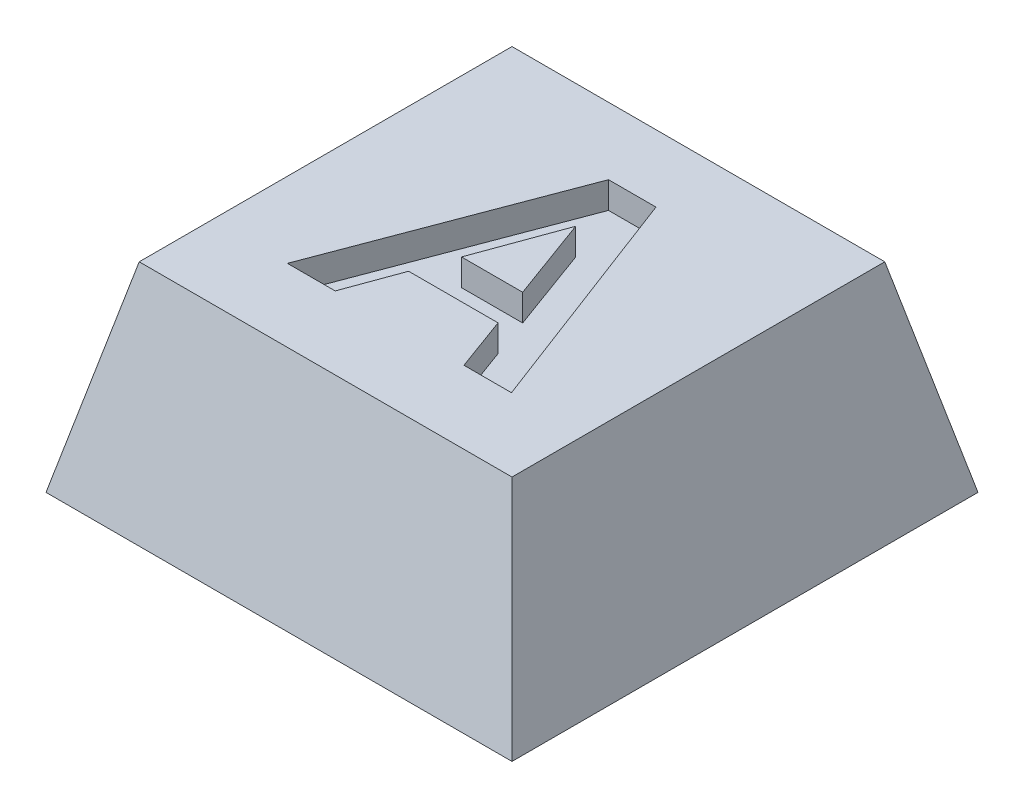
ISO-10303-21;
HEADER;
FILE_DESCRIPTION(('STEP AP214'),'2;1');
FILE_NAME('part.step','',(''),(''),'','','');
FILE_SCHEMA(('AUTOMOTIVE_DESIGN { 1 0 10303 214 1 1 1 1 }'));
ENDSEC;
DATA;
#1=APPLICATION_CONTEXT('core data for automotive mechanical design processes');
#2=APPLICATION_PROTOCOL_DEFINITION('international standard','automotive_design',2000,#1);
#3=PRODUCT_CONTEXT('',#1,'mechanical');
#4=PRODUCT('Part','Part','',(#3));
#5=PRODUCT_RELATED_PRODUCT_CATEGORY('part','',(#4));
#6=PRODUCT_DEFINITION_FORMATION('','',#4);
#7=PRODUCT_DEFINITION_CONTEXT('part definition',#1,'design');
#8=PRODUCT_DEFINITION('design','',#6,#7);
#9=PRODUCT_DEFINITION_SHAPE('','',#8);
#10=(LENGTH_UNIT() NAMED_UNIT(*) SI_UNIT(.MILLI.,.METRE.));
#11=(NAMED_UNIT(*) PLANE_ANGLE_UNIT() SI_UNIT($,.RADIAN.));
#12=(NAMED_UNIT(*) SI_UNIT($,.STERADIAN.) SOLID_ANGLE_UNIT());
#13=UNCERTAINTY_MEASURE_WITH_UNIT(LENGTH_MEASURE(1.E-05),#10,'distance_accuracy_value','');
#14=(GEOMETRIC_REPRESENTATION_CONTEXT(3) GLOBAL_UNCERTAINTY_ASSIGNED_CONTEXT((#13)) GLOBAL_UNIT_ASSIGNED_CONTEXT((#10,
#11,#12)) REPRESENTATION_CONTEXT('',''));
#15=CARTESIAN_POINT('',(0.,0.,0.));
#16=DIRECTION('',(0.,0.,1.));
#17=DIRECTION('',(1.,0.,0.));
#18=AXIS2_PLACEMENT_3D('',#15,#16,#17);
#19=CARTESIAN_POINT('',(0.,3.,0.));
#20=DIRECTION('',(0.,-1.,0.));
#21=DIRECTION('',(0.,0.,-1.));
#22=AXIS2_PLACEMENT_3D('',#19,#20,#21);
#23=PLANE('',#22);
#24=DIRECTION('',(-1.,0.,0.));
#25=VECTOR('',#24,1.);
#26=CARTESIAN_POINT('',(11.,3.,-0.7));
#27=LINE('',#26,#25);
#28=CARTESIAN_POINT('',(6.3,3.,-0.7));
#29=VERTEX_POINT('',#28);
#30=CARTESIAN_POINT('',(0.7,3.,-0.7));
#31=VERTEX_POINT('',#30);
#32=EDGE_CURVE('E280',#29,#31,#27,.T.);
#33=ORIENTED_EDGE('',*,*,#32,.F.);
#34=DIRECTION('',(0.,0.,1.));
#35=VECTOR('',#34,1.);
#36=CARTESIAN_POINT('',(6.3,3.,-7.));
#37=LINE('',#36,#35);
#38=CARTESIAN_POINT('',(6.3,3.,-6.3));
#39=VERTEX_POINT('',#38);
#40=EDGE_CURVE('E292',#39,#29,#37,.T.);
#41=ORIENTED_EDGE('',*,*,#40,.F.);
#42=DIRECTION('',(-1.,0.,0.));
#43=VECTOR('',#42,1.);
#44=CARTESIAN_POINT('',(11.,3.,-6.3));
#45=LINE('',#44,#43);
#46=CARTESIAN_POINT('',(0.699999999999998,3.,-6.3));
#47=VERTEX_POINT('',#46);
#48=EDGE_CURVE('E276',#39,#47,#45,.T.);
#49=ORIENTED_EDGE('',*,*,#48,.T.);
#50=DIRECTION('',(0.,0.,1.));
#51=VECTOR('',#50,1.);
#52=CARTESIAN_POINT('',(0.7,3.,-7.));
#53=LINE('',#52,#51);
#54=EDGE_CURVE('E293',#47,#31,#53,.T.);
#55=ORIENTED_EDGE('',*,*,#54,.T.);
#56=EDGE_LOOP('',(#33,#41,#49,#55));
#57=FACE_BOUND('',#56,.T.);
#58=DIRECTION('',(0.355060662326772,0.,0.934843262835046));
#59=VECTOR('',#58,1.);
#60=CARTESIAN_POINT('',(3.86955668779265,3.,-5.29301718970727));
#61=LINE('',#60,#59);
#62=CARTESIAN_POINT('',(3.86955668779265,3.,-5.29301718970727));
#63=VERTEX_POINT('',#62);
#64=CARTESIAN_POINT('',(5.19888361086957,3.,-1.79301718970727));
#65=VERTEX_POINT('',#64);
#66=EDGE_CURVE('E58',#63,#65,#61,.T.);
#67=ORIENTED_EDGE('',*,*,#66,.T.);
#68=DIRECTION('',(-1.,0.,0.));
#69=VECTOR('',#68,1.);
#70=CARTESIAN_POINT('',(5.19888361086957,3.,-1.79301718970727));
#71=LINE('',#70,#69);
#72=CARTESIAN_POINT('',(4.48514162369008,3.,-1.79301718970727));
#73=VERTEX_POINT('',#72);
#74=EDGE_CURVE('E221',#65,#73,#71,.T.);
#75=ORIENTED_EDGE('',*,*,#74,.T.);
#76=DIRECTION('',(-0.343248282132194,0.,-0.939244705501872));
#77=VECTOR('',#76,1.);
#78=CARTESIAN_POINT('',(4.48514162369008,3.,-1.79301718970727));
#79=LINE('',#78,#77);
#80=CARTESIAN_POINT('',(4.18996934804906,3.,-2.60070949739958));
#81=VERTEX_POINT('',#80);
#82=EDGE_CURVE('E225',#73,#81,#79,.T.);
#83=ORIENTED_EDGE('',*,*,#82,.T.);
#84=DIRECTION('',(-1.,0.,0.));
#85=VECTOR('',#84,1.);
#86=CARTESIAN_POINT('',(4.18996934804906,3.,-2.60070949739958));
#87=LINE('',#86,#85);
#88=CARTESIAN_POINT('',(2.8466199890747,3.,-2.60070949739958));
#89=VERTEX_POINT('',#88);
#90=EDGE_CURVE('E229',#81,#89,#87,.T.);
#91=ORIENTED_EDGE('',*,*,#90,.T.);
#92=DIRECTION('',(-0.343248282132194,0.,0.939244705501872));
#93=VECTOR('',#92,1.);
#94=CARTESIAN_POINT('',(2.8466199890747,3.,-2.60070949739958));
#95=LINE('',#94,#93);
#96=CARTESIAN_POINT('',(2.55144771343367,3.,-1.79301718970727));
#97=VERTEX_POINT('',#96);
#98=EDGE_CURVE('E233',#89,#97,#95,.T.);
#99=ORIENTED_EDGE('',*,*,#98,.T.);
#100=DIRECTION('',(-1.,0.,0.));
#101=VECTOR('',#100,1.);
#102=CARTESIAN_POINT('',(2.55144771343367,3.,-1.79301718970727));
#103=LINE('',#102,#101);
#104=CARTESIAN_POINT('',(1.83349899548495,3.,-1.79301718970727));
#105=VERTEX_POINT('',#104);
#106=EDGE_CURVE('E237',#97,#105,#103,.T.);
#107=ORIENTED_EDGE('',*,*,#106,.T.);
#108=DIRECTION('',(0.353586403368764,0.,-0.935401868371419));
#109=VECTOR('',#108,1.);
#110=CARTESIAN_POINT('',(1.83349899548495,3.,-1.79301718970727));
#111=LINE('',#110,#109);
#112=CARTESIAN_POINT('',(3.15651582240803,3.,-5.29301718970727));
#113=VERTEX_POINT('',#112);
#114=EDGE_CURVE('E241',#105,#113,#111,.T.);
#115=ORIENTED_EDGE('',*,*,#114,.T.);
#116=DIRECTION('',(1.,0.,0.));
#117=VECTOR('',#116,1.);
#118=CARTESIAN_POINT('',(3.15651582240803,3.,-5.29301718970727));
#119=LINE('',#118,#117);
#120=EDGE_CURVE('E197',#113,#63,#119,.T.);
#121=ORIENTED_EDGE('',*,*,#120,.T.);
#122=EDGE_LOOP('',(#67,#75,#83,#91,#99,#107,#115,#121));
#123=FACE_BOUND('',#122,.T.);
#124=ADVANCED_FACE('F42',(#57,#123),#23,.F.);
#125=CARTESIAN_POINT('',(7.,0.,-7.));
#126=DIRECTION('',(-0.973841209741793,-0.227229615606418,0.));
#127=DIRECTION('',(0.227229615606418,-0.973841209741793,0.));
#128=AXIS2_PLACEMENT_3D('',#125,#126,#127);
#129=PLANE('',#128);
#130=DIRECTION('',(-0.221581128241521,0.949633406749377,-0.221581128241521));
#131=VECTOR('',#130,1.);
#132=CARTESIAN_POINT('',(6.6563126252505,1.47294589178357,-0.343687374749499));
#133=LINE('',#132,#131);
#134=CARTESIAN_POINT('',(7.,0.,0.));
#135=VERTEX_POINT('',#134);
#136=EDGE_CURVE('E289',#135,#29,#133,.T.);
#137=ORIENTED_EDGE('',*,*,#136,.F.);
#138=DIRECTION('',(0.,0.,-1.));
#139=VECTOR('',#138,1.);
#140=CARTESIAN_POINT('',(7.,0.,0.));
#141=LINE('',#140,#139);
#142=CARTESIAN_POINT('',(7.,0.,-7.));
#143=VERTEX_POINT('',#142);
#144=EDGE_CURVE('E307',#135,#143,#141,.T.);
#145=ORIENTED_EDGE('',*,*,#144,.T.);
#146=DIRECTION('',(0.221581128241521,-0.949633406749377,-0.221581128241521));
#147=VECTOR('',#146,1.);
#148=CARTESIAN_POINT('',(7.,0.,-7.));
#149=LINE('',#148,#147);
#150=EDGE_CURVE('E283',#39,#143,#149,.T.);
#151=ORIENTED_EDGE('',*,*,#150,.F.);
#152=ORIENTED_EDGE('',*,*,#40,.T.);
#153=EDGE_LOOP('',(#137,#145,#151,#152));
#154=FACE_BOUND('',#153,.T.);
#155=ADVANCED_FACE('F333',(#154),#129,.F.);
#156=CARTESIAN_POINT('',(0.,0.,-7.));
#157=DIRECTION('',(0.973841209741793,-0.227229615606418,0.));
#158=DIRECTION('',(0.227229615606418,0.973841209741793,0.));
#159=AXIS2_PLACEMENT_3D('',#156,#157,#158);
#160=PLANE('',#159);
#161=DIRECTION('',(-0.221581128241521,-0.949633406749378,0.221581128241521));
#162=VECTOR('',#161,1.);
#163=CARTESIAN_POINT('',(0.343687374749499,1.47294589178357,-0.3436873747495));
#164=LINE('',#163,#162);
#165=CARTESIAN_POINT('',(0.,0.,0.));
#166=VERTEX_POINT('',#165);
#167=EDGE_CURVE('E11',#31,#166,#164,.T.);
#168=ORIENTED_EDGE('',*,*,#167,.F.);
#169=ORIENTED_EDGE('',*,*,#54,.F.);
#170=DIRECTION('',(0.221581128241521,0.949633406749377,0.221581128241521));
#171=VECTOR('',#170,1.);
#172=CARTESIAN_POINT('',(0.,0.,-7.));
#173=LINE('',#172,#171);
#174=CARTESIAN_POINT('',(0.,0.,-7.));
#175=VERTEX_POINT('',#174);
#176=EDGE_CURVE('E51',#175,#47,#173,.T.);
#177=ORIENTED_EDGE('',*,*,#176,.F.);
#178=DIRECTION('',(0.,0.,1.));
#179=VECTOR('',#178,1.);
#180=CARTESIAN_POINT('',(0.,0.,0.));
#181=LINE('',#180,#179);
#182=EDGE_CURVE('E297',#175,#166,#181,.T.);
#183=ORIENTED_EDGE('',*,*,#182,.T.);
#184=EDGE_LOOP('',(#168,#169,#177,#183));
#185=FACE_BOUND('',#184,.T.);
#186=ADVANCED_FACE('F327',(#185),#160,.F.);
#187=CARTESIAN_POINT('',(0.,0.,0.));
#188=DIRECTION('',(0.,-1.,0.));
#189=DIRECTION('',(0.,0.,-1.));
#190=AXIS2_PLACEMENT_3D('',#187,#188,#189);
#191=PLANE('',#190);
#192=CARTESIAN_POINT('',(3.5,0.,-3.5));
#193=DIRECTION('',(0.,-1.,0.));
#194=DIRECTION('',(0.,0.,-1.));
#195=AXIS2_PLACEMENT_3D('',#192,#193,#194);
#196=CIRCLE('',#195,1.8);
#197=CARTESIAN_POINT('',(3.5,0.,-5.3));
#198=VERTEX_POINT('',#197);
#199=EDGE_CURVE('E271',#198,#198,#196,.T.);
#200=ORIENTED_EDGE('',*,*,#199,.F.);
#201=EDGE_LOOP('',(#200));
#202=FACE_BOUND('',#201,.T.);
#203=ORIENTED_EDGE('',*,*,#182,.F.);
#204=DIRECTION('',(-1.,0.,0.));
#205=VECTOR('',#204,1.);
#206=CARTESIAN_POINT('',(0.,0.,-7.));
#207=LINE('',#206,#205);
#208=EDGE_CURVE('E311',#143,#175,#207,.T.);
#209=ORIENTED_EDGE('',*,*,#208,.F.);
#210=ORIENTED_EDGE('',*,*,#144,.F.);
#211=DIRECTION('',(1.,0.,0.));
#212=VECTOR('',#211,1.);
#213=CARTESIAN_POINT('',(0.,0.,0.));
#214=LINE('',#213,#212);
#215=EDGE_CURVE('E304',#166,#135,#214,.T.);
#216=ORIENTED_EDGE('',*,*,#215,.F.);
#217=EDGE_LOOP('',(#203,#209,#210,#216));
#218=FACE_BOUND('',#217,.T.);
#219=ADVANCED_FACE('F44',(#202,#218),#191,.T.);
#220=CARTESIAN_POINT('',(11.,3.,-6.3));
#221=DIRECTION('',(0.,0.227229615606418,-0.973841209741793));
#222=DIRECTION('',(0.,0.973841209741793,0.227229615606418));
#223=AXIS2_PLACEMENT_3D('',#220,#221,#222);
#224=PLANE('',#223);
#225=ORIENTED_EDGE('',*,*,#150,.T.);
#226=ORIENTED_EDGE('',*,*,#208,.T.);
#227=ORIENTED_EDGE('',*,*,#176,.T.);
#228=ORIENTED_EDGE('',*,*,#48,.F.);
#229=EDGE_LOOP('',(#225,#226,#227,#228));
#230=FACE_BOUND('',#229,.T.);
#231=ADVANCED_FACE('F316',(#230),#224,.T.);
#232=CARTESIAN_POINT('',(11.,0.,0.));
#233=DIRECTION('',(0.,0.227229615606418,0.973841209741793));
#234=DIRECTION('',(0.,-0.973841209741793,0.227229615606418));
#235=AXIS2_PLACEMENT_3D('',#232,#233,#234);
#236=PLANE('',#235);
#237=ORIENTED_EDGE('',*,*,#136,.T.);
#238=ORIENTED_EDGE('',*,*,#32,.T.);
#239=ORIENTED_EDGE('',*,*,#167,.T.);
#240=ORIENTED_EDGE('',*,*,#215,.T.);
#241=EDGE_LOOP('',(#237,#238,#239,#240));
#242=FACE_BOUND('',#241,.T.);
#243=ADVANCED_FACE('F330',(#242),#236,.T.);
#244=CARTESIAN_POINT('',(3.5,0.8,-3.5));
#245=DIRECTION('',(0.,-1.,0.));
#246=DIRECTION('',(0.,0.,-1.));
#247=AXIS2_PLACEMENT_3D('',#244,#245,#246);
#248=CYLINDRICAL_SURFACE('',#247,1.8);
#249=CARTESIAN_POINT('',(3.5,0.8,-3.5));
#250=DIRECTION('',(0.,-1.,0.));
#251=DIRECTION('',(0.,0.,-1.));
#252=AXIS2_PLACEMENT_3D('',#249,#250,#251);
#253=CIRCLE('',#252,1.8);
#254=CARTESIAN_POINT('',(3.5,0.8,-5.3));
#255=VERTEX_POINT('',#254);
#256=EDGE_CURVE('E272',#255,#255,#253,.T.);
#257=ORIENTED_EDGE('',*,*,#256,.F.);
#258=EDGE_LOOP('',(#257));
#259=FACE_BOUND('',#258,.T.);
#260=ORIENTED_EDGE('',*,*,#199,.T.);
#261=EDGE_LOOP('',(#260));
#262=FACE_BOUND('',#261,.T.);
#263=ADVANCED_FACE('F403',(#259,#262),#248,.F.);
#264=CARTESIAN_POINT('',(3.5,0.8,-3.5));
#265=DIRECTION('',(0.,-1.,0.));
#266=DIRECTION('',(0.,0.,-1.));
#267=AXIS2_PLACEMENT_3D('',#264,#265,#266);
#268=PLANE('',#267);
#269=ORIENTED_EDGE('',*,*,#256,.T.);
#270=EDGE_LOOP('',(#269));
#271=FACE_BOUND('',#270,.T.);
#272=ADVANCED_FACE('F400',(#271),#268,.T.);
#273=CARTESIAN_POINT('',(3.86955668779265,2.6,-5.29301718970727));
#274=DIRECTION('',(-0.934843262835045,0.,0.355060662326772));
#275=DIRECTION('',(0.355060662326772,0.,0.934843262835045));
#276=AXIS2_PLACEMENT_3D('',#273,#274,#275);
#277=PLANE('',#276);
#278=ORIENTED_EDGE('',*,*,#66,.F.);
#279=DIRECTION('',(0.,1.,0.));
#280=VECTOR('',#279,1.);
#281=CARTESIAN_POINT('',(3.86955668779265,2.6,-5.29301718970727));
#282=LINE('',#281,#280);
#283=CARTESIAN_POINT('',(3.86955668779265,2.6,-5.29301718970727));
#284=VERTEX_POINT('',#283);
#285=EDGE_CURVE('E218',#284,#63,#282,.T.);
#286=ORIENTED_EDGE('',*,*,#285,.F.);
#287=DIRECTION('',(0.355060662326772,0.,0.934843262835046));
#288=VECTOR('',#287,1.);
#289=CARTESIAN_POINT('',(3.86955668779265,2.6,-5.29301718970727));
#290=LINE('',#289,#288);
#291=CARTESIAN_POINT('',(5.19888361086957,2.6,-1.79301718970727));
#292=VERTEX_POINT('',#291);
#293=EDGE_CURVE('E192',#284,#292,#290,.T.);
#294=ORIENTED_EDGE('',*,*,#293,.T.);
#295=DIRECTION('',(0.,1.,0.));
#296=VECTOR('',#295,1.);
#297=CARTESIAN_POINT('',(5.19888361086957,2.6,-1.79301718970727));
#298=LINE('',#297,#296);
#299=EDGE_CURVE('E268',#292,#65,#298,.T.);
#300=ORIENTED_EDGE('',*,*,#299,.T.);
#301=EDGE_LOOP('',(#278,#286,#294,#300));
#302=FACE_BOUND('',#301,.T.);
#303=ADVANCED_FACE('F396',(#302),#277,.T.);
#304=CARTESIAN_POINT('',(5.19888361086957,2.6,-1.79301718970727));
#305=DIRECTION('',(0.,0.,-1.));
#306=DIRECTION('',(-1.,0.,0.));
#307=AXIS2_PLACEMENT_3D('',#304,#305,#306);
#308=PLANE('',#307);
#309=ORIENTED_EDGE('',*,*,#74,.F.);
#310=ORIENTED_EDGE('',*,*,#299,.F.);
#311=DIRECTION('',(-1.,0.,0.));
#312=VECTOR('',#311,1.);
#313=CARTESIAN_POINT('',(5.19888361086957,2.6,-1.79301718970727));
#314=LINE('',#313,#312);
#315=CARTESIAN_POINT('',(4.48514162369008,2.6,-1.79301718970727));
#316=VERTEX_POINT('',#315);
#317=EDGE_CURVE('E196',#292,#316,#314,.T.);
#318=ORIENTED_EDGE('',*,*,#317,.T.);
#319=DIRECTION('',(0.,1.,0.));
#320=VECTOR('',#319,1.);
#321=CARTESIAN_POINT('',(4.48514162369008,2.6,-1.79301718970727));
#322=LINE('',#321,#320);
#323=EDGE_CURVE('E265',#316,#73,#322,.T.);
#324=ORIENTED_EDGE('',*,*,#323,.T.);
#325=EDGE_LOOP('',(#309,#310,#318,#324));
#326=FACE_BOUND('',#325,.T.);
#327=ADVANCED_FACE('F392',(#326),#308,.T.);
#328=CARTESIAN_POINT('',(4.48514162369008,2.6,-1.79301718970727));
#329=DIRECTION('',(0.939244705501872,0.,-0.343248282132194));
#330=DIRECTION('',(-0.343248282132194,0.,-0.939244705501872));
#331=AXIS2_PLACEMENT_3D('',#328,#329,#330);
#332=PLANE('',#331);
#333=ORIENTED_EDGE('',*,*,#82,.F.);
#334=ORIENTED_EDGE('',*,*,#323,.F.);
#335=DIRECTION('',(-0.343248282132194,0.,-0.939244705501872));
#336=VECTOR('',#335,1.);
#337=CARTESIAN_POINT('',(4.48514162369008,2.6,-1.79301718970727));
#338=LINE('',#337,#336);
#339=CARTESIAN_POINT('',(4.18996934804906,2.6,-2.60070949739958));
#340=VERTEX_POINT('',#339);
#341=EDGE_CURVE('E200',#316,#340,#338,.T.);
#342=ORIENTED_EDGE('',*,*,#341,.T.);
#343=DIRECTION('',(0.,1.,0.));
#344=VECTOR('',#343,1.);
#345=CARTESIAN_POINT('',(4.18996934804906,2.6,-2.60070949739958));
#346=LINE('',#345,#344);
#347=EDGE_CURVE('E262',#340,#81,#346,.T.);
#348=ORIENTED_EDGE('',*,*,#347,.T.);
#349=EDGE_LOOP('',(#333,#334,#342,#348));
#350=FACE_BOUND('',#349,.T.);
#351=ADVANCED_FACE('F388',(#350),#332,.T.);
#352=CARTESIAN_POINT('',(4.18996934804906,2.6,-2.60070949739958));
#353=DIRECTION('',(0.,0.,-1.));
#354=DIRECTION('',(-1.,0.,0.));
#355=AXIS2_PLACEMENT_3D('',#352,#353,#354);
#356=PLANE('',#355);
#357=ORIENTED_EDGE('',*,*,#90,.F.);
#358=ORIENTED_EDGE('',*,*,#347,.F.);
#359=DIRECTION('',(-1.,0.,0.));
#360=VECTOR('',#359,1.);
#361=CARTESIAN_POINT('',(4.18996934804906,2.6,-2.60070949739958));
#362=LINE('',#361,#360);
#363=CARTESIAN_POINT('',(2.8466199890747,2.6,-2.60070949739958));
#364=VERTEX_POINT('',#363);
#365=EDGE_CURVE('E203',#340,#364,#362,.T.);
#366=ORIENTED_EDGE('',*,*,#365,.T.);
#367=DIRECTION('',(0.,1.,0.));
#368=VECTOR('',#367,1.);
#369=CARTESIAN_POINT('',(2.8466199890747,2.6,-2.60070949739958));
#370=LINE('',#369,#368);
#371=EDGE_CURVE('E259',#364,#89,#370,.T.);
#372=ORIENTED_EDGE('',*,*,#371,.T.);
#373=EDGE_LOOP('',(#357,#358,#366,#372));
#374=FACE_BOUND('',#373,.T.);
#375=ADVANCED_FACE('F384',(#374),#356,.T.);
#376=CARTESIAN_POINT('',(2.8466199890747,2.6,-2.60070949739958));
#377=DIRECTION('',(-0.939244705501872,0.,-0.343248282132194));
#378=DIRECTION('',(-0.343248282132194,0.,0.939244705501872));
#379=AXIS2_PLACEMENT_3D('',#376,#377,#378);
#380=PLANE('',#379);
#381=ORIENTED_EDGE('',*,*,#98,.F.);
#382=ORIENTED_EDGE('',*,*,#371,.F.);
#383=DIRECTION('',(-0.343248282132194,0.,0.939244705501872));
#384=VECTOR('',#383,1.);
#385=CARTESIAN_POINT('',(2.8466199890747,2.6,-2.60070949739958));
#386=LINE('',#385,#384);
#387=CARTESIAN_POINT('',(2.55144771343367,2.6,-1.79301718970727));
#388=VERTEX_POINT('',#387);
#389=EDGE_CURVE('E206',#364,#388,#386,.T.);
#390=ORIENTED_EDGE('',*,*,#389,.T.);
#391=DIRECTION('',(0.,1.,0.));
#392=VECTOR('',#391,1.);
#393=CARTESIAN_POINT('',(2.55144771343367,2.6,-1.79301718970727));
#394=LINE('',#393,#392);
#395=EDGE_CURVE('E256',#388,#97,#394,.T.);
#396=ORIENTED_EDGE('',*,*,#395,.T.);
#397=EDGE_LOOP('',(#381,#382,#390,#396));
#398=FACE_BOUND('',#397,.T.);
#399=ADVANCED_FACE('F380',(#398),#380,.T.);
#400=CARTESIAN_POINT('',(2.55144771343367,2.6,-1.79301718970727));
#401=DIRECTION('',(0.,0.,-1.));
#402=DIRECTION('',(-1.,0.,0.));
#403=AXIS2_PLACEMENT_3D('',#400,#401,#402);
#404=PLANE('',#403);
#405=ORIENTED_EDGE('',*,*,#106,.F.);
#406=ORIENTED_EDGE('',*,*,#395,.F.);
#407=DIRECTION('',(-1.,0.,0.));
#408=VECTOR('',#407,1.);
#409=CARTESIAN_POINT('',(2.55144771343367,2.6,-1.79301718970727));
#410=LINE('',#409,#408);
#411=CARTESIAN_POINT('',(1.83349899548495,2.6,-1.79301718970727));
#412=VERTEX_POINT('',#411);
#413=EDGE_CURVE('E209',#388,#412,#410,.T.);
#414=ORIENTED_EDGE('',*,*,#413,.T.);
#415=DIRECTION('',(0.,1.,0.));
#416=VECTOR('',#415,1.);
#417=CARTESIAN_POINT('',(1.83349899548495,2.6,-1.79301718970727));
#418=LINE('',#417,#416);
#419=EDGE_CURVE('E253',#412,#105,#418,.T.);
#420=ORIENTED_EDGE('',*,*,#419,.T.);
#421=EDGE_LOOP('',(#405,#406,#414,#420));
#422=FACE_BOUND('',#421,.T.);
#423=ADVANCED_FACE('F376',(#422),#404,.T.);
#424=CARTESIAN_POINT('',(1.83349899548495,2.6,-1.79301718970727));
#425=DIRECTION('',(0.935401868371419,0.,0.353586403368764));
#426=DIRECTION('',(0.353586403368764,0.,-0.935401868371419));
#427=AXIS2_PLACEMENT_3D('',#424,#425,#426);
#428=PLANE('',#427);
#429=ORIENTED_EDGE('',*,*,#114,.F.);
#430=ORIENTED_EDGE('',*,*,#419,.F.);
#431=DIRECTION('',(0.353586403368764,0.,-0.935401868371419));
#432=VECTOR('',#431,1.);
#433=CARTESIAN_POINT('',(1.83349899548495,2.6,-1.79301718970727));
#434=LINE('',#433,#432);
#435=CARTESIAN_POINT('',(3.15651582240803,2.6,-5.29301718970727));
#436=VERTEX_POINT('',#435);
#437=EDGE_CURVE('E212',#412,#436,#434,.T.);
#438=ORIENTED_EDGE('',*,*,#437,.T.);
#439=DIRECTION('',(0.,1.,0.));
#440=VECTOR('',#439,1.);
#441=CARTESIAN_POINT('',(3.15651582240803,2.6,-5.29301718970727));
#442=LINE('',#441,#440);
#443=EDGE_CURVE('E250',#436,#113,#442,.T.);
#444=ORIENTED_EDGE('',*,*,#443,.T.);
#445=EDGE_LOOP('',(#429,#430,#438,#444));
#446=FACE_BOUND('',#445,.T.);
#447=ADVANCED_FACE('F372',(#446),#428,.T.);
#448=CARTESIAN_POINT('',(3.15651582240803,2.6,-5.29301718970727));
#449=DIRECTION('',(0.,0.,1.));
#450=DIRECTION('',(1.,0.,0.));
#451=AXIS2_PLACEMENT_3D('',#448,#449,#450);
#452=PLANE('',#451);
#453=ORIENTED_EDGE('',*,*,#120,.F.);
#454=ORIENTED_EDGE('',*,*,#443,.F.);
#455=DIRECTION('',(1.,0.,0.));
#456=VECTOR('',#455,1.);
#457=CARTESIAN_POINT('',(3.15651582240803,2.6,-5.29301718970727));
#458=LINE('',#457,#456);
#459=EDGE_CURVE('E215',#436,#284,#458,.T.);
#460=ORIENTED_EDGE('',*,*,#459,.T.);
#461=ORIENTED_EDGE('',*,*,#285,.T.);
#462=EDGE_LOOP('',(#453,#454,#460,#461));
#463=FACE_BOUND('',#462,.T.);
#464=ADVANCED_FACE('F369',(#463),#452,.T.);
#465=CARTESIAN_POINT('',(0.,2.6,0.));
#466=DIRECTION('',(0.,-1.,0.));
#467=DIRECTION('',(0.,0.,-1.));
#468=AXIS2_PLACEMENT_3D('',#465,#466,#467);
#469=PLANE('',#468);
#470=DIRECTION('',(1.,0.,0.));
#471=VECTOR('',#470,1.);
#472=CARTESIAN_POINT('',(3.05765764933111,2.6,-3.18404283073291));
#473=LINE('',#472,#471);
#474=CARTESIAN_POINT('',(3.05765764933111,2.6,-3.18404283073291));
#475=VERTEX_POINT('',#474);
#476=CARTESIAN_POINT('',(3.97612720061316,2.6,-3.18404283073291));
#477=VERTEX_POINT('',#476);
#478=EDGE_CURVE('E170',#475,#477,#473,.T.);
#479=ORIENTED_EDGE('',*,*,#478,.F.);
#480=DIRECTION('',(-0.342837179853215,0.,0.939394841432661));
#481=VECTOR('',#480,1.);
#482=CARTESIAN_POINT('',(3.51619130317726,2.6,-4.44045308714317));
#483=LINE('',#482,#481);
#484=CARTESIAN_POINT('',(3.51619130317726,2.6,-4.44045308714317));
#485=VERTEX_POINT('',#484);
#486=EDGE_CURVE('E164',#485,#475,#483,.T.);
#487=ORIENTED_EDGE('',*,*,#486,.F.);
#488=DIRECTION('',(-0.343761882683261,0.,-0.939056850256714));
#489=VECTOR('',#488,1.);
#490=CARTESIAN_POINT('',(3.97612720061316,2.6,-3.18404283073291));
#491=LINE('',#490,#489);
#492=EDGE_CURVE('E155',#477,#485,#491,.T.);
#493=ORIENTED_EDGE('',*,*,#492,.F.);
#494=EDGE_LOOP('',(#479,#487,#493));
#495=FACE_BOUND('',#494,.T.);
#496=ORIENTED_EDGE('',*,*,#293,.F.);
#497=ORIENTED_EDGE('',*,*,#459,.F.);
#498=ORIENTED_EDGE('',*,*,#437,.F.);
#499=ORIENTED_EDGE('',*,*,#413,.F.);
#500=ORIENTED_EDGE('',*,*,#389,.F.);
#501=ORIENTED_EDGE('',*,*,#365,.F.);
#502=ORIENTED_EDGE('',*,*,#341,.F.);
#503=ORIENTED_EDGE('',*,*,#317,.F.);
#504=EDGE_LOOP('',(#496,#497,#498,#499,#500,#501,#502,#503));
#505=FACE_BOUND('',#504,.T.);
#506=ADVANCED_FACE('F168',(#495,#505),#469,.F.);
#507=CARTESIAN_POINT('',(3.05765764933111,2.6,-3.18404283073291));
#508=DIRECTION('',(0.,0.,1.));
#509=DIRECTION('',(1.,0.,0.));
#510=AXIS2_PLACEMENT_3D('',#507,#508,#509);
#511=PLANE('',#510);
#512=DIRECTION('',(1.,0.,0.));
#513=VECTOR('',#512,1.);
#514=CARTESIAN_POINT('',(3.05765764933111,3.,-3.18404283073291));
#515=LINE('',#514,#513);
#516=CARTESIAN_POINT('',(3.05765764933111,3.,-3.18404283073291));
#517=VERTEX_POINT('',#516);
#518=CARTESIAN_POINT('',(3.97612720061316,3.,-3.18404283073291));
#519=VERTEX_POINT('',#518);
#520=EDGE_CURVE('E183',#517,#519,#515,.T.);
#521=ORIENTED_EDGE('',*,*,#520,.F.);
#522=DIRECTION('',(0.,1.,0.));
#523=VECTOR('',#522,1.);
#524=CARTESIAN_POINT('',(3.05765764933111,2.6,-3.18404283073291));
#525=LINE('',#524,#523);
#526=EDGE_CURVE('E175',#475,#517,#525,.T.);
#527=ORIENTED_EDGE('',*,*,#526,.F.);
#528=ORIENTED_EDGE('',*,*,#478,.T.);
#529=DIRECTION('',(0.,1.,0.));
#530=VECTOR('',#529,1.);
#531=CARTESIAN_POINT('',(3.97612720061316,2.6,-3.18404283073291));
#532=LINE('',#531,#530);
#533=EDGE_CURVE('E152',#477,#519,#532,.T.);
#534=ORIENTED_EDGE('',*,*,#533,.T.);
#535=EDGE_LOOP('',(#521,#527,#528,#534));
#536=FACE_BOUND('',#535,.T.);
#537=ADVANCED_FACE('F174',(#536),#511,.T.);
#538=CARTESIAN_POINT('',(3.51619130317726,2.6,-4.44045308714317));
#539=DIRECTION('',(-0.939394841432661,0.,-0.342837179853215));
#540=DIRECTION('',(-0.342837179853215,0.,0.939394841432661));
#541=AXIS2_PLACEMENT_3D('',#538,#539,#540);
#542=PLANE('',#541);
#543=DIRECTION('',(-0.342837179853215,0.,0.939394841432661));
#544=VECTOR('',#543,1.);
#545=CARTESIAN_POINT('',(3.51619130317726,3.,-4.44045308714317));
#546=LINE('',#545,#544);
#547=CARTESIAN_POINT('',(3.51619130317726,3.,-4.44045308714317));
#548=VERTEX_POINT('',#547);
#549=EDGE_CURVE('E66',#548,#517,#546,.T.);
#550=ORIENTED_EDGE('',*,*,#549,.F.);
#551=DIRECTION('',(0.,1.,0.));
#552=VECTOR('',#551,1.);
#553=CARTESIAN_POINT('',(3.51619130317726,2.6,-4.44045308714317));
#554=LINE('',#553,#552);
#555=EDGE_CURVE('E163',#485,#548,#554,.T.);
#556=ORIENTED_EDGE('',*,*,#555,.F.);
#557=ORIENTED_EDGE('',*,*,#486,.T.);
#558=ORIENTED_EDGE('',*,*,#526,.T.);
#559=EDGE_LOOP('',(#550,#556,#557,#558));
#560=FACE_BOUND('',#559,.T.);
#561=ADVANCED_FACE('F359',(#560),#542,.T.);
#562=CARTESIAN_POINT('',(3.97612720061316,2.6,-3.18404283073291));
#563=DIRECTION('',(0.939056850256714,0.,-0.343761882683261));
#564=DIRECTION('',(-0.343761882683261,0.,-0.939056850256714));
#565=AXIS2_PLACEMENT_3D('',#562,#563,#564);
#566=PLANE('',#565);
#567=DIRECTION('',(-0.343761882683261,0.,-0.939056850256714));
#568=VECTOR('',#567,1.);
#569=CARTESIAN_POINT('',(3.97612720061316,3.,-3.18404283073291));
#570=LINE('',#569,#568);
#571=EDGE_CURVE('E157',#519,#548,#570,.T.);
#572=ORIENTED_EDGE('',*,*,#571,.F.);
#573=ORIENTED_EDGE('',*,*,#533,.F.);
#574=ORIENTED_EDGE('',*,*,#492,.T.);
#575=ORIENTED_EDGE('',*,*,#555,.T.);
#576=EDGE_LOOP('',(#572,#573,#574,#575));
#577=FACE_BOUND('',#576,.T.);
#578=ADVANCED_FACE('F154',(#577),#566,.T.);
#579=ORIENTED_EDGE('',*,*,#520,.T.);
#580=ORIENTED_EDGE('',*,*,#571,.T.);
#581=ORIENTED_EDGE('',*,*,#549,.T.);
#582=EDGE_LOOP('',(#579,#580,#581));
#583=FACE_BOUND('',#582,.T.);
#584=ADVANCED_FACE('F346',(#583),#23,.F.);
#585=CLOSED_SHELL('',(#124,#155,#186,#219,#231,#243,#263,#272,#303,#327,#351,#375,#399,#423,
#447,#464,#506,#537,#561,#578,#584));
#586=MANIFOLD_SOLID_BREP('B2',#585);
#587=ADVANCED_BREP_SHAPE_REPRESENTATION('',(#18,#586),#14);
#588=SHAPE_DEFINITION_REPRESENTATION(#9,#587);
ENDSEC;
END-ISO-10303-21;
